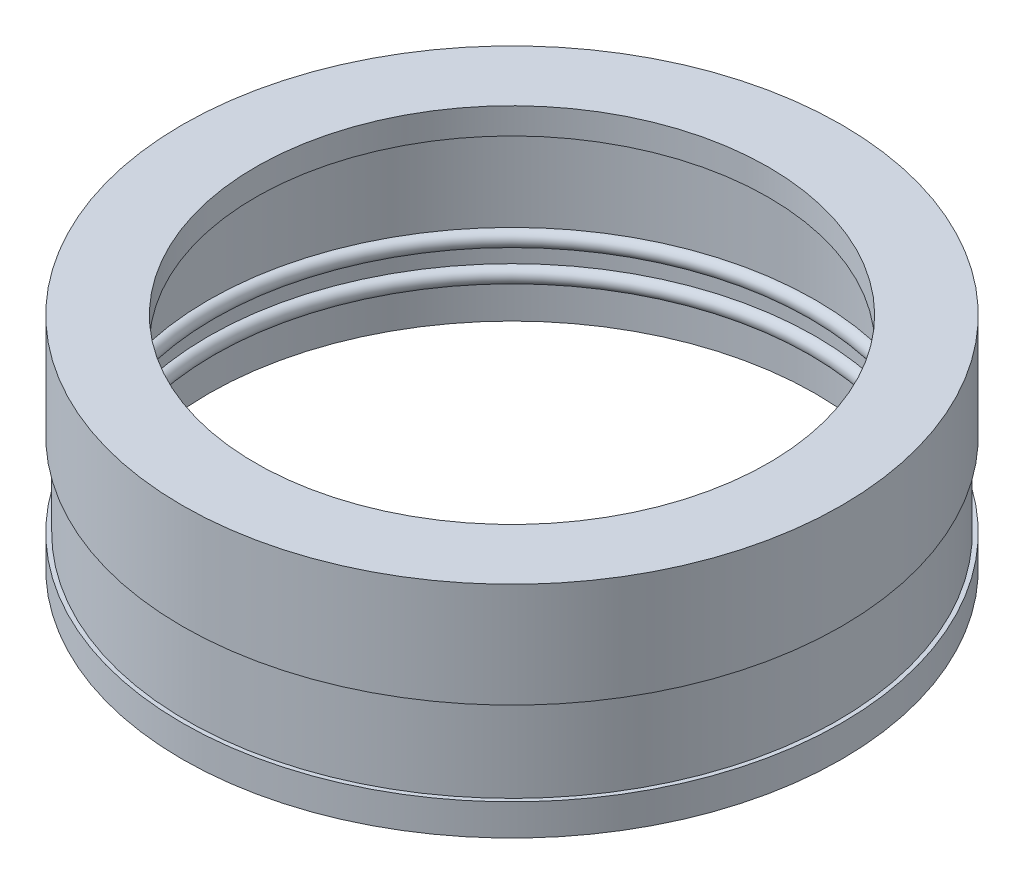
ISO-10303-21;
HEADER;
FILE_DESCRIPTION(('STEP AP214'),'2;1');
FILE_NAME('part.step','',(''),(''),'','','');
FILE_SCHEMA(('AUTOMOTIVE_DESIGN { 1 0 10303 214 1 1 1 1 }'));
ENDSEC;
DATA;
#1=APPLICATION_CONTEXT('core data for automotive mechanical design processes');
#2=APPLICATION_PROTOCOL_DEFINITION('international standard','automotive_design',2000,#1);
#3=PRODUCT_CONTEXT('',#1,'mechanical');
#4=PRODUCT('Part','Part','',(#3));
#5=PRODUCT_RELATED_PRODUCT_CATEGORY('part','',(#4));
#6=PRODUCT_DEFINITION_FORMATION('','',#4);
#7=PRODUCT_DEFINITION_CONTEXT('part definition',#1,'design');
#8=PRODUCT_DEFINITION('design','',#6,#7);
#9=PRODUCT_DEFINITION_SHAPE('','',#8);
#10=(LENGTH_UNIT() NAMED_UNIT(*) SI_UNIT(.MILLI.,.METRE.));
#11=(NAMED_UNIT(*) PLANE_ANGLE_UNIT() SI_UNIT($,.RADIAN.));
#12=(NAMED_UNIT(*) SI_UNIT($,.STERADIAN.) SOLID_ANGLE_UNIT());
#13=UNCERTAINTY_MEASURE_WITH_UNIT(LENGTH_MEASURE(1.E-05),#10,'distance_accuracy_value','');
#14=(GEOMETRIC_REPRESENTATION_CONTEXT(3) GLOBAL_UNCERTAINTY_ASSIGNED_CONTEXT((#13)) GLOBAL_UNIT_ASSIGNED_CONTEXT((#10,
#11,#12)) REPRESENTATION_CONTEXT('',''));
#15=CARTESIAN_POINT('',(0.,0.,0.));
#16=DIRECTION('',(0.,0.,1.));
#17=DIRECTION('',(1.,0.,0.));
#18=AXIS2_PLACEMENT_3D('',#15,#16,#17);
#19=CARTESIAN_POINT('',(0.,0.,0.));
#20=DIRECTION('',(0.,-1.,0.));
#21=DIRECTION('',(0.,0.,-1.));
#22=AXIS2_PLACEMENT_3D('',#19,#20,#21);
#23=CYLINDRICAL_SURFACE('',#22,49.);
#24=CARTESIAN_POINT('',(0.,37.,0.));
#25=DIRECTION('',(0.,-1.,0.));
#26=DIRECTION('',(0.,0.,-1.));
#27=AXIS2_PLACEMENT_3D('',#24,#25,#26);
#28=CIRCLE('',#27,49.);
#29=CARTESIAN_POINT('',(0.,37.,-49.));
#30=VERTEX_POINT('',#29);
#31=EDGE_CURVE('E96',#30,#30,#28,.T.);
#32=ORIENTED_EDGE('',*,*,#31,.T.);
#33=EDGE_LOOP('',(#32));
#34=FACE_BOUND('',#33,.T.);
#35=CARTESIAN_POINT('',(0.,42.,0.));
#36=DIRECTION('',(0.,-1.,0.));
#37=DIRECTION('',(0.,0.,-1.));
#38=AXIS2_PLACEMENT_3D('',#35,#36,#37);
#39=CIRCLE('',#38,49.);
#40=CARTESIAN_POINT('',(0.,42.,-49.));
#41=VERTEX_POINT('',#40);
#42=EDGE_CURVE('E10',#41,#41,#39,.T.);
#43=ORIENTED_EDGE('',*,*,#42,.F.);
#44=EDGE_LOOP('',(#43));
#45=FACE_BOUND('',#44,.T.);
#46=ADVANCED_FACE('F37',(#34,#45),#23,.F.);
#47=CARTESIAN_POINT('',(49.,42.,0.));
#48=DIRECTION('',(0.,1.,0.));
#49=DIRECTION('',(0.,0.,1.));
#50=AXIS2_PLACEMENT_3D('',#47,#48,#49);
#51=PLANE('',#50);
#52=ORIENTED_EDGE('',*,*,#42,.T.);
#53=EDGE_LOOP('',(#52));
#54=FACE_BOUND('',#53,.T.);
#55=CARTESIAN_POINT('',(0.,42.,0.));
#56=DIRECTION('',(0.,-1.,0.));
#57=DIRECTION('',(0.,0.,-1.));
#58=AXIS2_PLACEMENT_3D('',#55,#56,#57);
#59=CIRCLE('',#58,63.);
#60=CARTESIAN_POINT('',(0.,42.,-63.));
#61=VERTEX_POINT('',#60);
#62=EDGE_CURVE('E44',#61,#61,#59,.T.);
#63=ORIENTED_EDGE('',*,*,#62,.F.);
#64=EDGE_LOOP('',(#63));
#65=FACE_BOUND('',#64,.T.);
#66=ADVANCED_FACE('F115',(#54,#65),#51,.T.);
#67=CARTESIAN_POINT('',(0.,0.,0.));
#68=DIRECTION('',(0.,-1.,0.));
#69=DIRECTION('',(0.,0.,-1.));
#70=AXIS2_PLACEMENT_3D('',#67,#68,#69);
#71=CYLINDRICAL_SURFACE('',#70,63.);
#72=ORIENTED_EDGE('',*,*,#62,.T.);
#73=EDGE_LOOP('',(#72));
#74=FACE_BOUND('',#73,.T.);
#75=CARTESIAN_POINT('',(0.,22.,0.));
#76=DIRECTION('',(0.,-1.,0.));
#77=DIRECTION('',(0.,0.,-1.));
#78=AXIS2_PLACEMENT_3D('',#75,#76,#77);
#79=CIRCLE('',#78,63.);
#80=CARTESIAN_POINT('',(0.,22.,-63.));
#81=VERTEX_POINT('',#80);
#82=EDGE_CURVE('E49',#81,#81,#79,.T.);
#83=ORIENTED_EDGE('',*,*,#82,.F.);
#84=EDGE_LOOP('',(#83));
#85=FACE_BOUND('',#84,.T.);
#86=ADVANCED_FACE('F119',(#74,#85),#71,.T.);
#87=CARTESIAN_POINT('',(63.,22.,0.));
#88=DIRECTION('',(0.,-1.,0.));
#89=DIRECTION('',(0.,0.,-1.));
#90=AXIS2_PLACEMENT_3D('',#87,#88,#89);
#91=PLANE('',#90);
#92=ORIENTED_EDGE('',*,*,#82,.T.);
#93=EDGE_LOOP('',(#92));
#94=FACE_BOUND('',#93,.T.);
#95=CARTESIAN_POINT('',(0.,22.,0.));
#96=DIRECTION('',(0.,-1.,0.));
#97=DIRECTION('',(0.,0.,-1.));
#98=AXIS2_PLACEMENT_3D('',#95,#96,#97);
#99=CIRCLE('',#98,62.2);
#100=CARTESIAN_POINT('',(0.,22.,-62.2));
#101=VERTEX_POINT('',#100);
#102=EDGE_CURVE('E54',#101,#101,#99,.T.);
#103=ORIENTED_EDGE('',*,*,#102,.F.);
#104=EDGE_LOOP('',(#103));
#105=FACE_BOUND('',#104,.T.);
#106=ADVANCED_FACE('F123',(#94,#105),#91,.T.);
#107=CARTESIAN_POINT('',(0.,0.,0.));
#108=DIRECTION('',(0.,-1.,0.));
#109=DIRECTION('',(0.,0.,-1.));
#110=AXIS2_PLACEMENT_3D('',#107,#108,#109);
#111=CYLINDRICAL_SURFACE('',#110,62.2);
#112=ORIENTED_EDGE('',*,*,#102,.T.);
#113=EDGE_LOOP('',(#112));
#114=FACE_BOUND('',#113,.T.);
#115=CARTESIAN_POINT('',(0.,6.,0.));
#116=DIRECTION('',(0.,-1.,0.));
#117=DIRECTION('',(0.,0.,-1.));
#118=AXIS2_PLACEMENT_3D('',#115,#116,#117);
#119=CIRCLE('',#118,62.2);
#120=CARTESIAN_POINT('',(0.,6.,-62.2));
#121=VERTEX_POINT('',#120);
#122=EDGE_CURVE('E60',#121,#121,#119,.T.);
#123=ORIENTED_EDGE('',*,*,#122,.F.);
#124=EDGE_LOOP('',(#123));
#125=FACE_BOUND('',#124,.T.);
#126=ADVANCED_FACE('F129',(#114,#125),#111,.T.);
#127=CARTESIAN_POINT('',(62.2,6.,0.));
#128=DIRECTION('',(0.,1.,0.));
#129=DIRECTION('',(0.,0.,1.));
#130=AXIS2_PLACEMENT_3D('',#127,#128,#129);
#131=PLANE('',#130);
#132=ORIENTED_EDGE('',*,*,#122,.T.);
#133=EDGE_LOOP('',(#132));
#134=FACE_BOUND('',#133,.T.);
#135=CARTESIAN_POINT('',(0.,6.,0.));
#136=DIRECTION('',(0.,-1.,0.));
#137=DIRECTION('',(0.,0.,-1.));
#138=AXIS2_PLACEMENT_3D('',#135,#136,#137);
#139=CIRCLE('',#138,63.);
#140=CARTESIAN_POINT('',(0.,6.,-63.));
#141=VERTEX_POINT('',#140);
#142=EDGE_CURVE('E64',#141,#141,#139,.T.);
#143=ORIENTED_EDGE('',*,*,#142,.F.);
#144=EDGE_LOOP('',(#143));
#145=FACE_BOUND('',#144,.T.);
#146=ADVANCED_FACE('F133',(#134,#145),#131,.T.);
#147=CARTESIAN_POINT('',(0.,0.,0.));
#148=DIRECTION('',(0.,-1.,0.));
#149=DIRECTION('',(0.,0.,-1.));
#150=AXIS2_PLACEMENT_3D('',#147,#148,#149);
#151=CYLINDRICAL_SURFACE('',#150,63.);
#152=ORIENTED_EDGE('',*,*,#142,.T.);
#153=EDGE_LOOP('',(#152));
#154=FACE_BOUND('',#153,.T.);
#155=CARTESIAN_POINT('',(0.,0.,0.));
#156=DIRECTION('',(0.,-1.,0.));
#157=DIRECTION('',(0.,0.,-1.));
#158=AXIS2_PLACEMENT_3D('',#155,#156,#157);
#159=CIRCLE('',#158,63.);
#160=CARTESIAN_POINT('',(0.,0.,-63.));
#161=VERTEX_POINT('',#160);
#162=EDGE_CURVE('E68',#161,#161,#159,.T.);
#163=ORIENTED_EDGE('',*,*,#162,.F.);
#164=EDGE_LOOP('',(#163));
#165=FACE_BOUND('',#164,.T.);
#166=ADVANCED_FACE('F137',(#154,#165),#151,.T.);
#167=CARTESIAN_POINT('',(63.,0.,0.));
#168=DIRECTION('',(0.,-1.,0.));
#169=DIRECTION('',(0.,0.,-1.));
#170=AXIS2_PLACEMENT_3D('',#167,#168,#169);
#171=PLANE('',#170);
#172=ORIENTED_EDGE('',*,*,#162,.T.);
#173=EDGE_LOOP('',(#172));
#174=FACE_BOUND('',#173,.T.);
#175=CARTESIAN_POINT('',(0.,0.,0.));
#176=DIRECTION('',(0.,-1.,0.));
#177=DIRECTION('',(0.,0.,-1.));
#178=AXIS2_PLACEMENT_3D('',#175,#176,#177);
#179=CIRCLE('',#178,58.);
#180=CARTESIAN_POINT('',(0.,0.,-58.));
#181=VERTEX_POINT('',#180);
#182=EDGE_CURVE('E72',#181,#181,#179,.T.);
#183=ORIENTED_EDGE('',*,*,#182,.F.);
#184=EDGE_LOOP('',(#183));
#185=FACE_BOUND('',#184,.T.);
#186=ADVANCED_FACE('F141',(#174,#185),#171,.T.);
#187=CARTESIAN_POINT('',(0.,0.,0.));
#188=DIRECTION('',(0.,-1.,0.));
#189=DIRECTION('',(0.,0.,-1.));
#190=AXIS2_PLACEMENT_3D('',#187,#188,#189);
#191=CYLINDRICAL_SURFACE('',#190,58.);
#192=ORIENTED_EDGE('',*,*,#182,.T.);
#193=EDGE_LOOP('',(#192));
#194=FACE_BOUND('',#193,.T.);
#195=CARTESIAN_POINT('',(0.,6.5,0.));
#196=DIRECTION('',(0.,-1.,0.));
#197=DIRECTION('',(0.,0.,-1.));
#198=AXIS2_PLACEMENT_3D('',#195,#196,#197);
#199=CIRCLE('',#198,58.);
#200=CARTESIAN_POINT('',(0.,6.5,-58.));
#201=VERTEX_POINT('',#200);
#202=EDGE_CURVE('E76',#201,#201,#199,.T.);
#203=ORIENTED_EDGE('',*,*,#202,.F.);
#204=EDGE_LOOP('',(#203));
#205=FACE_BOUND('',#204,.T.);
#206=ADVANCED_FACE('F145',(#194,#205),#191,.F.);
#207=CARTESIAN_POINT('',(0.,8.,0.));
#208=DIRECTION('',(0.,-1.,0.));
#209=DIRECTION('',(0.,0.,-1.));
#210=AXIS2_PLACEMENT_3D('',#207,#208,#209);
#211=TOROIDAL_SURFACE('',#210,58.,1.5);
#212=ORIENTED_EDGE('',*,*,#202,.T.);
#213=EDGE_LOOP('',(#212));
#214=FACE_BOUND('',#213,.T.);
#215=CARTESIAN_POINT('',(0.,9.5,0.));
#216=DIRECTION('',(0.,-1.,0.));
#217=DIRECTION('',(0.,0.,-1.));
#218=AXIS2_PLACEMENT_3D('',#215,#216,#217);
#219=CIRCLE('',#218,58.);
#220=CARTESIAN_POINT('',(0.,9.5,-58.));
#221=VERTEX_POINT('',#220);
#222=EDGE_CURVE('E80',#221,#221,#219,.T.);
#223=ORIENTED_EDGE('',*,*,#222,.F.);
#224=EDGE_LOOP('',(#223));
#225=FACE_BOUND('',#224,.T.);
#226=ADVANCED_FACE('F149',(#214,#225),#211,.T.);
#227=CARTESIAN_POINT('',(0.,0.,0.));
#228=DIRECTION('',(0.,-1.,0.));
#229=DIRECTION('',(0.,0.,-1.));
#230=AXIS2_PLACEMENT_3D('',#227,#228,#229);
#231=CYLINDRICAL_SURFACE('',#230,58.);
#232=ORIENTED_EDGE('',*,*,#222,.T.);
#233=EDGE_LOOP('',(#232));
#234=FACE_BOUND('',#233,.T.);
#235=CARTESIAN_POINT('',(0.,12.5,0.));
#236=DIRECTION('',(0.,-1.,0.));
#237=DIRECTION('',(0.,0.,-1.));
#238=AXIS2_PLACEMENT_3D('',#235,#236,#237);
#239=CIRCLE('',#238,58.);
#240=CARTESIAN_POINT('',(0.,12.5,-58.));
#241=VERTEX_POINT('',#240);
#242=EDGE_CURVE('E84',#241,#241,#239,.T.);
#243=ORIENTED_EDGE('',*,*,#242,.F.);
#244=EDGE_LOOP('',(#243));
#245=FACE_BOUND('',#244,.T.);
#246=ADVANCED_FACE('F153',(#234,#245),#231,.F.);
#247=CARTESIAN_POINT('',(0.,14.,0.));
#248=DIRECTION('',(0.,-1.,0.));
#249=DIRECTION('',(0.,0.,-1.));
#250=AXIS2_PLACEMENT_3D('',#247,#248,#249);
#251=TOROIDAL_SURFACE('',#250,58.,1.5);
#252=ORIENTED_EDGE('',*,*,#242,.T.);
#253=EDGE_LOOP('',(#252));
#254=FACE_BOUND('',#253,.T.);
#255=CARTESIAN_POINT('',(0.,15.5,0.));
#256=DIRECTION('',(0.,-1.,0.));
#257=DIRECTION('',(0.,0.,-1.));
#258=AXIS2_PLACEMENT_3D('',#255,#256,#257);
#259=CIRCLE('',#258,58.);
#260=CARTESIAN_POINT('',(0.,15.5,-58.));
#261=VERTEX_POINT('',#260);
#262=EDGE_CURVE('E88',#261,#261,#259,.T.);
#263=ORIENTED_EDGE('',*,*,#262,.F.);
#264=EDGE_LOOP('',(#263));
#265=FACE_BOUND('',#264,.T.);
#266=ADVANCED_FACE('F111',(#254,#265),#251,.T.);
#267=CARTESIAN_POINT('',(0.,0.,0.));
#268=DIRECTION('',(0.,-1.,0.));
#269=DIRECTION('',(0.,0.,-1.));
#270=AXIS2_PLACEMENT_3D('',#267,#268,#269);
#271=CYLINDRICAL_SURFACE('',#270,58.);
#272=ORIENTED_EDGE('',*,*,#262,.T.);
#273=EDGE_LOOP('',(#272));
#274=FACE_BOUND('',#273,.T.);
#275=CARTESIAN_POINT('',(0.,37.,0.));
#276=DIRECTION('',(0.,-1.,0.));
#277=DIRECTION('',(0.,0.,-1.));
#278=AXIS2_PLACEMENT_3D('',#275,#276,#277);
#279=CIRCLE('',#278,58.);
#280=CARTESIAN_POINT('',(0.,37.,-58.));
#281=VERTEX_POINT('',#280);
#282=EDGE_CURVE('E92',#281,#281,#279,.T.);
#283=ORIENTED_EDGE('',*,*,#282,.F.);
#284=EDGE_LOOP('',(#283));
#285=FACE_BOUND('',#284,.T.);
#286=ADVANCED_FACE('F105',(#274,#285),#271,.F.);
#287=CARTESIAN_POINT('',(58.,37.,0.));
#288=DIRECTION('',(0.,-1.,0.));
#289=DIRECTION('',(0.,0.,-1.));
#290=AXIS2_PLACEMENT_3D('',#287,#288,#289);
#291=PLANE('',#290);
#292=ORIENTED_EDGE('',*,*,#282,.T.);
#293=EDGE_LOOP('',(#292));
#294=FACE_BOUND('',#293,.T.);
#295=ORIENTED_EDGE('',*,*,#31,.F.);
#296=EDGE_LOOP('',(#295));
#297=FACE_BOUND('',#296,.T.);
#298=ADVANCED_FACE('F103',(#294,#297),#291,.T.);
#299=CLOSED_SHELL('',(#46,#66,#86,#106,#126,#146,#166,#186,#206,#226,#246,#266,#286,#298));
#300=MANIFOLD_SOLID_BREP('B2',#299);
#301=ADVANCED_BREP_SHAPE_REPRESENTATION('',(#18,#300),#14);
#302=SHAPE_DEFINITION_REPRESENTATION(#9,#301);
ENDSEC;
END-ISO-10303-21;
